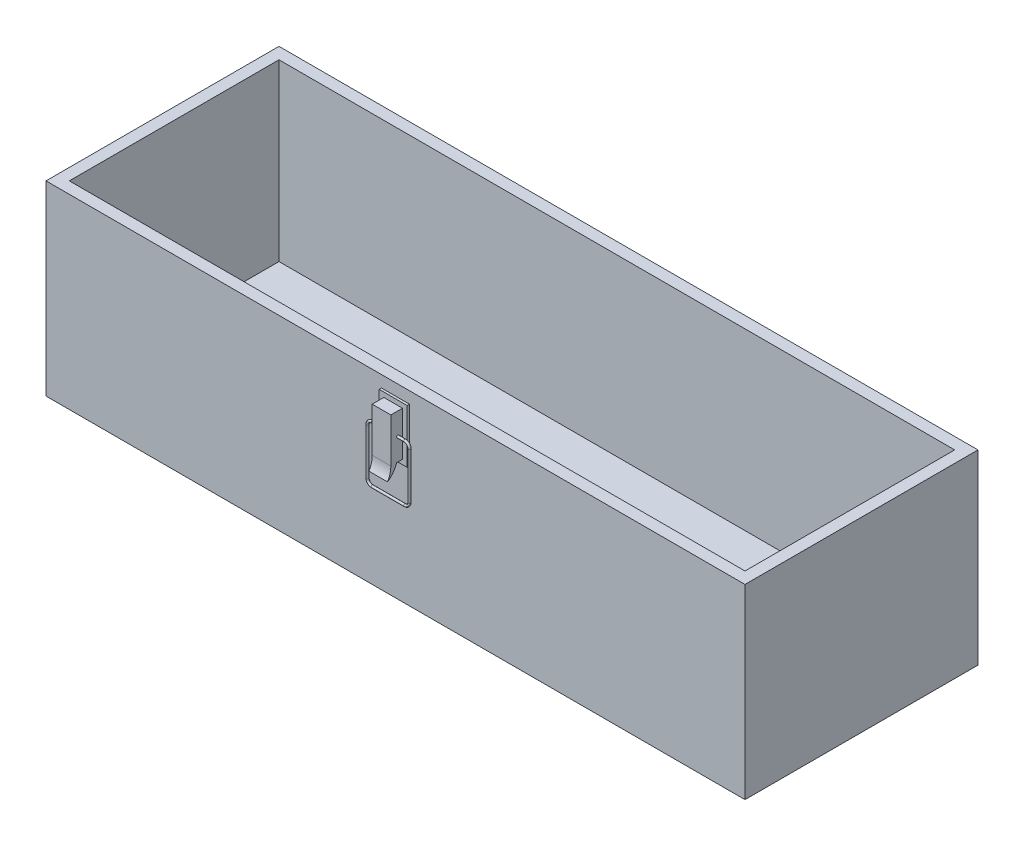
ISO-10303-21;
HEADER;
FILE_DESCRIPTION(('STEP AP214'),'2;1');
FILE_NAME('part.step','',(''),(''),'','','');
FILE_SCHEMA(('AUTOMOTIVE_DESIGN { 1 0 10303 214 1 1 1 1 }'));
ENDSEC;
DATA;
#1=APPLICATION_CONTEXT('core data for automotive mechanical design processes');
#2=APPLICATION_PROTOCOL_DEFINITION('international standard','automotive_design',2000,#1);
#3=PRODUCT_CONTEXT('',#1,'mechanical');
#4=PRODUCT('Part','Part','',(#3));
#5=PRODUCT_RELATED_PRODUCT_CATEGORY('part','',(#4));
#6=PRODUCT_DEFINITION_FORMATION('','',#4);
#7=PRODUCT_DEFINITION_CONTEXT('part definition',#1,'design');
#8=PRODUCT_DEFINITION('design','',#6,#7);
#9=PRODUCT_DEFINITION_SHAPE('','',#8);
#10=(LENGTH_UNIT() NAMED_UNIT(*) SI_UNIT(.MILLI.,.METRE.));
#11=(NAMED_UNIT(*) PLANE_ANGLE_UNIT() SI_UNIT($,.RADIAN.));
#12=(NAMED_UNIT(*) SI_UNIT($,.STERADIAN.) SOLID_ANGLE_UNIT());
#13=UNCERTAINTY_MEASURE_WITH_UNIT(LENGTH_MEASURE(1.E-05),#10,'distance_accuracy_value','');
#14=(GEOMETRIC_REPRESENTATION_CONTEXT(3) GLOBAL_UNCERTAINTY_ASSIGNED_CONTEXT((#13)) GLOBAL_UNIT_ASSIGNED_CONTEXT((#10,
#11,#12)) REPRESENTATION_CONTEXT('',''));
#15=CARTESIAN_POINT('',(0.,0.,0.));
#16=DIRECTION('',(0.,0.,1.));
#17=DIRECTION('',(1.,0.,0.));
#18=AXIS2_PLACEMENT_3D('',#15,#16,#17);
#19=CARTESIAN_POINT('',(0.,0.,51.));
#20=DIRECTION('',(0.,0.,1.));
#21=DIRECTION('',(1.,0.,0.));
#22=AXIS2_PLACEMENT_3D('',#19,#20,#21);
#23=PLANE('',#22);
#24=DIRECTION('',(0.,1.,0.));
#25=VECTOR('',#24,1.);
#26=CARTESIAN_POINT('',(5.99999999999999,75.,51.));
#27=LINE('',#26,#25);
#28=CARTESIAN_POINT('',(6.,52.,51.));
#29=VERTEX_POINT('',#28);
#30=CARTESIAN_POINT('',(5.99999999999999,75.,51.));
#31=VERTEX_POINT('',#30);
#32=EDGE_CURVE('E218',#29,#31,#27,.T.);
#33=ORIENTED_EDGE('',*,*,#32,.T.);
#34=DIRECTION('',(-1.,0.,0.));
#35=VECTOR('',#34,1.);
#36=CARTESIAN_POINT('',(-6.,75.,51.));
#37=LINE('',#36,#35);
#38=CARTESIAN_POINT('',(-6.,75.,51.));
#39=VERTEX_POINT('',#38);
#40=EDGE_CURVE('E221',#31,#39,#37,.T.);
#41=ORIENTED_EDGE('',*,*,#40,.T.);
#42=DIRECTION('',(0.,-1.,0.));
#43=VECTOR('',#42,1.);
#44=CARTESIAN_POINT('',(-6.,75.,51.));
#45=LINE('',#44,#43);
#46=CARTESIAN_POINT('',(-6.,52.,51.));
#47=VERTEX_POINT('',#46);
#48=EDGE_CURVE('E224',#39,#47,#45,.T.);
#49=ORIENTED_EDGE('',*,*,#48,.T.);
#50=DIRECTION('',(1.,0.,0.));
#51=VECTOR('',#50,1.);
#52=CARTESIAN_POINT('',(-6.,52.,51.));
#53=LINE('',#52,#51);
#54=EDGE_CURVE('E226',#47,#29,#53,.T.);
#55=ORIENTED_EDGE('',*,*,#54,.T.);
#56=EDGE_LOOP('',(#33,#41,#49,#55));
#57=FACE_BOUND('',#56,.T.);
#58=DIRECTION('',(0.,1.,0.));
#59=VECTOR('',#58,1.);
#60=CARTESIAN_POINT('',(4.,54.,51.));
#61=LINE('',#60,#59);
#62=CARTESIAN_POINT('',(4.,54.,51.));
#63=VERTEX_POINT('',#62);
#64=CARTESIAN_POINT('',(4.,73.,51.));
#65=VERTEX_POINT('',#64);
#66=EDGE_CURVE('E205',#63,#65,#61,.T.);
#67=ORIENTED_EDGE('',*,*,#66,.F.);
#68=DIRECTION('',(1.,0.,0.));
#69=VECTOR('',#68,1.);
#70=CARTESIAN_POINT('',(-4.,54.,51.));
#71=LINE('',#70,#69);
#72=CARTESIAN_POINT('',(-4.,54.,51.));
#73=VERTEX_POINT('',#72);
#74=EDGE_CURVE('E192',#73,#63,#71,.T.);
#75=ORIENTED_EDGE('',*,*,#74,.F.);
#76=DIRECTION('',(0.,-1.,0.));
#77=VECTOR('',#76,1.);
#78=CARTESIAN_POINT('',(-4.,73.,51.));
#79=LINE('',#78,#77);
#80=CARTESIAN_POINT('',(-4.,73.,51.));
#81=VERTEX_POINT('',#80);
#82=EDGE_CURVE('E195',#81,#73,#79,.T.);
#83=ORIENTED_EDGE('',*,*,#82,.F.);
#84=DIRECTION('',(-1.,0.,0.));
#85=VECTOR('',#84,1.);
#86=CARTESIAN_POINT('',(4.,73.,51.));
#87=LINE('',#86,#85);
#88=EDGE_CURVE('E207',#65,#81,#87,.T.);
#89=ORIENTED_EDGE('',*,*,#88,.F.);
#90=EDGE_LOOP('',(#67,#75,#83,#89));
#91=FACE_BOUND('',#90,.T.);
#92=ADVANCED_FACE('F33',(#57,#91),#23,.T.);
#93=CARTESIAN_POINT('',(-150.,80.,50.));
#94=DIRECTION('',(0.,0.,-1.));
#95=DIRECTION('',(-1.,0.,0.));
#96=AXIS2_PLACEMENT_3D('',#93,#94,#95);
#97=PLANE('',#96);
#98=DIRECTION('',(1.,0.,0.));
#99=VECTOR('',#98,1.);
#100=CARTESIAN_POINT('',(-150.,0.,50.));
#101=LINE('',#100,#99);
#102=CARTESIAN_POINT('',(-150.,0.,50.));
#103=VERTEX_POINT('',#102);
#104=CARTESIAN_POINT('',(150.,0.,50.));
#105=VERTEX_POINT('',#104);
#106=EDGE_CURVE('E282',#103,#105,#101,.T.);
#107=ORIENTED_EDGE('',*,*,#106,.T.);
#108=DIRECTION('',(0.,-1.,0.));
#109=VECTOR('',#108,1.);
#110=CARTESIAN_POINT('',(150.,80.,50.));
#111=LINE('',#110,#109);
#112=CARTESIAN_POINT('',(150.,80.,50.));
#113=VERTEX_POINT('',#112);
#114=EDGE_CURVE('E288',#113,#105,#111,.T.);
#115=ORIENTED_EDGE('',*,*,#114,.F.);
#116=DIRECTION('',(1.,0.,0.));
#117=VECTOR('',#116,1.);
#118=CARTESIAN_POINT('',(-150.,80.,50.));
#119=LINE('',#118,#117);
#120=CARTESIAN_POINT('',(-150.,80.,50.));
#121=VERTEX_POINT('',#120);
#122=EDGE_CURVE('E286',#121,#113,#119,.T.);
#123=ORIENTED_EDGE('',*,*,#122,.F.);
#124=DIRECTION('',(0.,-1.,0.));
#125=VECTOR('',#124,1.);
#126=CARTESIAN_POINT('',(-150.,80.,50.));
#127=LINE('',#126,#125);
#128=EDGE_CURVE('E298',#121,#103,#127,.T.);
#129=ORIENTED_EDGE('',*,*,#128,.T.);
#130=EDGE_LOOP('',(#107,#115,#123,#129));
#131=FACE_BOUND('',#130,.T.);
#132=DIRECTION('',(0.,1.,0.));
#133=VECTOR('',#132,1.);
#134=CARTESIAN_POINT('',(5.99999999999999,75.,50.));
#135=LINE('',#134,#133);
#136=CARTESIAN_POINT('',(6.,52.,50.));
#137=VERTEX_POINT('',#136);
#138=CARTESIAN_POINT('',(6.00000000000001,75.,50.));
#139=VERTEX_POINT('',#138);
#140=EDGE_CURVE('E217',#137,#139,#135,.T.);
#141=ORIENTED_EDGE('',*,*,#140,.F.);
#142=DIRECTION('',(1.,0.,0.));
#143=VECTOR('',#142,1.);
#144=CARTESIAN_POINT('',(-6.,52.,50.));
#145=LINE('',#144,#143);
#146=CARTESIAN_POINT('',(-6.00000000000001,52.,50.));
#147=VERTEX_POINT('',#146);
#148=EDGE_CURVE('E222',#147,#137,#145,.T.);
#149=ORIENTED_EDGE('',*,*,#148,.F.);
#150=DIRECTION('',(0.,-1.,0.));
#151=VECTOR('',#150,1.);
#152=CARTESIAN_POINT('',(-6.,75.,50.));
#153=LINE('',#152,#151);
#154=CARTESIAN_POINT('',(-6.,75.,50.));
#155=VERTEX_POINT('',#154);
#156=EDGE_CURVE('E232',#155,#147,#153,.T.);
#157=ORIENTED_EDGE('',*,*,#156,.F.);
#158=DIRECTION('',(-1.,0.,0.));
#159=VECTOR('',#158,1.);
#160=CARTESIAN_POINT('',(-6.,75.,50.));
#161=LINE('',#160,#159);
#162=EDGE_CURVE('E56',#139,#155,#161,.T.);
#163=ORIENTED_EDGE('',*,*,#162,.F.);
#164=EDGE_LOOP('',(#141,#149,#157,#163));
#165=FACE_BOUND('',#164,.T.);
#166=ADVANCED_FACE('F314',(#131,#165),#97,.F.);
#167=CARTESIAN_POINT('',(0.,80.,0.));
#168=DIRECTION('',(0.,-1.,0.));
#169=DIRECTION('',(0.,0.,-1.));
#170=AXIS2_PLACEMENT_3D('',#167,#168,#169);
#171=PLANE('',#170);
#172=DIRECTION('',(0.,0.,-1.));
#173=VECTOR('',#172,1.);
#174=CARTESIAN_POINT('',(150.,80.,50.));
#175=LINE('',#174,#173);
#176=CARTESIAN_POINT('',(150.,80.,-50.));
#177=VERTEX_POINT('',#176);
#178=EDGE_CURVE('E278',#113,#177,#175,.T.);
#179=ORIENTED_EDGE('',*,*,#178,.T.);
#180=DIRECTION('',(-1.,0.,0.));
#181=VECTOR('',#180,1.);
#182=CARTESIAN_POINT('',(-150.,80.,-50.));
#183=LINE('',#182,#181);
#184=CARTESIAN_POINT('',(-150.,80.,-50.));
#185=VERTEX_POINT('',#184);
#186=EDGE_CURVE('E281',#177,#185,#183,.T.);
#187=ORIENTED_EDGE('',*,*,#186,.T.);
#188=DIRECTION('',(0.,0.,1.));
#189=VECTOR('',#188,1.);
#190=CARTESIAN_POINT('',(-150.,80.,50.));
#191=LINE('',#190,#189);
#192=EDGE_CURVE('E284',#185,#121,#191,.T.);
#193=ORIENTED_EDGE('',*,*,#192,.T.);
#194=ORIENTED_EDGE('',*,*,#122,.T.);
#195=EDGE_LOOP('',(#179,#187,#193,#194));
#196=FACE_BOUND('',#195,.T.);
#197=DIRECTION('',(0.,0.,-1.));
#198=VECTOR('',#197,1.);
#199=CARTESIAN_POINT('',(145.,80.,0.));
#200=LINE('',#199,#198);
#201=CARTESIAN_POINT('',(145.,80.,45.));
#202=VERTEX_POINT('',#201);
#203=CARTESIAN_POINT('',(145.,80.,-45.));
#204=VERTEX_POINT('',#203);
#205=EDGE_CURVE('E270',#202,#204,#200,.T.);
#206=ORIENTED_EDGE('',*,*,#205,.F.);
#207=DIRECTION('',(1.,0.,0.));
#208=VECTOR('',#207,1.);
#209=CARTESIAN_POINT('',(0.,80.,45.));
#210=LINE('',#209,#208);
#211=CARTESIAN_POINT('',(-145.,80.,45.));
#212=VERTEX_POINT('',#211);
#213=EDGE_CURVE('E260',#212,#202,#210,.T.);
#214=ORIENTED_EDGE('',*,*,#213,.F.);
#215=DIRECTION('',(0.,0.,1.));
#216=VECTOR('',#215,1.);
#217=CARTESIAN_POINT('',(-145.,80.,0.));
#218=LINE('',#217,#216);
#219=CARTESIAN_POINT('',(-145.,80.,-45.));
#220=VERTEX_POINT('',#219);
#221=EDGE_CURVE('E274',#220,#212,#218,.T.);
#222=ORIENTED_EDGE('',*,*,#221,.F.);
#223=DIRECTION('',(-1.,0.,0.));
#224=VECTOR('',#223,1.);
#225=CARTESIAN_POINT('',(0.,80.,-45.));
#226=LINE('',#225,#224);
#227=EDGE_CURVE('E272',#204,#220,#226,.T.);
#228=ORIENTED_EDGE('',*,*,#227,.F.);
#229=EDGE_LOOP('',(#206,#214,#222,#228));
#230=FACE_BOUND('',#229,.T.);
#231=ADVANCED_FACE('F320',(#196,#230),#171,.F.);
#232=CARTESIAN_POINT('',(150.,80.,50.));
#233=DIRECTION('',(-1.,0.,0.));
#234=DIRECTION('',(0.,0.,1.));
#235=AXIS2_PLACEMENT_3D('',#232,#233,#234);
#236=PLANE('',#235);
#237=DIRECTION('',(0.,0.,-1.));
#238=VECTOR('',#237,1.);
#239=CARTESIAN_POINT('',(150.,0.,50.));
#240=LINE('',#239,#238);
#241=CARTESIAN_POINT('',(150.,0.,-50.));
#242=VERTEX_POINT('',#241);
#243=EDGE_CURVE('E254',#105,#242,#240,.T.);
#244=ORIENTED_EDGE('',*,*,#243,.T.);
#245=DIRECTION('',(0.,-1.,0.));
#246=VECTOR('',#245,1.);
#247=CARTESIAN_POINT('',(150.,80.,-50.));
#248=LINE('',#247,#246);
#249=EDGE_CURVE('E11',#177,#242,#248,.T.);
#250=ORIENTED_EDGE('',*,*,#249,.F.);
#251=ORIENTED_EDGE('',*,*,#178,.F.);
#252=ORIENTED_EDGE('',*,*,#114,.T.);
#253=EDGE_LOOP('',(#244,#250,#251,#252));
#254=FACE_BOUND('',#253,.T.);
#255=ADVANCED_FACE('F35',(#254),#236,.F.);
#256=CARTESIAN_POINT('',(-150.,80.,-50.));
#257=DIRECTION('',(0.,0.,1.));
#258=DIRECTION('',(1.,0.,0.));
#259=AXIS2_PLACEMENT_3D('',#256,#257,#258);
#260=PLANE('',#259);
#261=DIRECTION('',(-1.,0.,0.));
#262=VECTOR('',#261,1.);
#263=CARTESIAN_POINT('',(-150.,0.,-50.));
#264=LINE('',#263,#262);
#265=CARTESIAN_POINT('',(-150.,0.,-50.));
#266=VERTEX_POINT('',#265);
#267=EDGE_CURVE('E291',#242,#266,#264,.T.);
#268=ORIENTED_EDGE('',*,*,#267,.T.);
#269=DIRECTION('',(0.,-1.,0.));
#270=VECTOR('',#269,1.);
#271=CARTESIAN_POINT('',(-150.,80.,-50.));
#272=LINE('',#271,#270);
#273=EDGE_CURVE('E41',#185,#266,#272,.T.);
#274=ORIENTED_EDGE('',*,*,#273,.F.);
#275=ORIENTED_EDGE('',*,*,#186,.F.);
#276=ORIENTED_EDGE('',*,*,#249,.T.);
#277=EDGE_LOOP('',(#268,#274,#275,#276));
#278=FACE_BOUND('',#277,.T.);
#279=ADVANCED_FACE('F322',(#278),#260,.F.);
#280=CARTESIAN_POINT('',(-150.,80.,50.));
#281=DIRECTION('',(1.,0.,0.));
#282=DIRECTION('',(0.,0.,-1.));
#283=AXIS2_PLACEMENT_3D('',#280,#281,#282);
#284=PLANE('',#283);
#285=DIRECTION('',(0.,0.,1.));
#286=VECTOR('',#285,1.);
#287=CARTESIAN_POINT('',(-150.,0.,50.));
#288=LINE('',#287,#286);
#289=EDGE_CURVE('E293',#266,#103,#288,.T.);
#290=ORIENTED_EDGE('',*,*,#289,.T.);
#291=ORIENTED_EDGE('',*,*,#128,.F.);
#292=ORIENTED_EDGE('',*,*,#192,.F.);
#293=ORIENTED_EDGE('',*,*,#273,.T.);
#294=EDGE_LOOP('',(#290,#291,#292,#293));
#295=FACE_BOUND('',#294,.T.);
#296=ADVANCED_FACE('F305',(#295),#284,.F.);
#297=CARTESIAN_POINT('',(0.,0.,0.));
#298=DIRECTION('',(0.,-1.,0.));
#299=DIRECTION('',(0.,0.,-1.));
#300=AXIS2_PLACEMENT_3D('',#297,#298,#299);
#301=PLANE('',#300);
#302=ORIENTED_EDGE('',*,*,#243,.F.);
#303=ORIENTED_EDGE('',*,*,#106,.F.);
#304=ORIENTED_EDGE('',*,*,#289,.F.);
#305=ORIENTED_EDGE('',*,*,#267,.F.);
#306=EDGE_LOOP('',(#302,#303,#304,#305));
#307=FACE_BOUND('',#306,.T.);
#308=ADVANCED_FACE('F311',(#307),#301,.T.);
#309=CARTESIAN_POINT('',(145.,80.,50.));
#310=DIRECTION('',(-1.,0.,0.));
#311=DIRECTION('',(0.,0.,1.));
#312=AXIS2_PLACEMENT_3D('',#309,#310,#311);
#313=PLANE('',#312);
#314=DIRECTION('',(0.,0.,-1.));
#315=VECTOR('',#314,1.);
#316=CARTESIAN_POINT('',(145.,5.,0.));
#317=LINE('',#316,#315);
#318=CARTESIAN_POINT('',(145.,5.,45.));
#319=VERTEX_POINT('',#318);
#320=CARTESIAN_POINT('',(145.,5.,-45.));
#321=VERTEX_POINT('',#320);
#322=EDGE_CURVE('E247',#319,#321,#317,.T.);
#323=ORIENTED_EDGE('',*,*,#322,.F.);
#324=DIRECTION('',(0.,-1.,0.));
#325=VECTOR('',#324,1.);
#326=CARTESIAN_POINT('',(145.,80.,45.));
#327=LINE('',#326,#325);
#328=EDGE_CURVE('E256',#202,#319,#327,.T.);
#329=ORIENTED_EDGE('',*,*,#328,.F.);
#330=ORIENTED_EDGE('',*,*,#205,.T.);
#331=DIRECTION('',(0.,-1.,0.));
#332=VECTOR('',#331,1.);
#333=CARTESIAN_POINT('',(145.,80.,-45.));
#334=LINE('',#333,#332);
#335=EDGE_CURVE('E251',#204,#321,#334,.T.);
#336=ORIENTED_EDGE('',*,*,#335,.T.);
#337=EDGE_LOOP('',(#323,#329,#330,#336));
#338=FACE_BOUND('',#337,.T.);
#339=ADVANCED_FACE('F358',(#338),#313,.T.);
#340=CARTESIAN_POINT('',(-150.,80.,-45.));
#341=DIRECTION('',(0.,0.,1.));
#342=DIRECTION('',(1.,0.,0.));
#343=AXIS2_PLACEMENT_3D('',#340,#341,#342);
#344=PLANE('',#343);
#345=DIRECTION('',(-1.,0.,0.));
#346=VECTOR('',#345,1.);
#347=CARTESIAN_POINT('',(0.,5.,-45.));
#348=LINE('',#347,#346);
#349=CARTESIAN_POINT('',(-145.,5.,-45.));
#350=VERTEX_POINT('',#349);
#351=EDGE_CURVE('E250',#321,#350,#348,.T.);
#352=ORIENTED_EDGE('',*,*,#351,.F.);
#353=ORIENTED_EDGE('',*,*,#335,.F.);
#354=ORIENTED_EDGE('',*,*,#227,.T.);
#355=DIRECTION('',(0.,-1.,0.));
#356=VECTOR('',#355,1.);
#357=CARTESIAN_POINT('',(-145.,80.,-45.));
#358=LINE('',#357,#356);
#359=EDGE_CURVE('E255',#220,#350,#358,.T.);
#360=ORIENTED_EDGE('',*,*,#359,.T.);
#361=EDGE_LOOP('',(#352,#353,#354,#360));
#362=FACE_BOUND('',#361,.T.);
#363=ADVANCED_FACE('F361',(#362),#344,.T.);
#364=CARTESIAN_POINT('',(-145.,80.,50.));
#365=DIRECTION('',(1.,0.,0.));
#366=DIRECTION('',(0.,0.,-1.));
#367=AXIS2_PLACEMENT_3D('',#364,#365,#366);
#368=PLANE('',#367);
#369=DIRECTION('',(0.,0.,1.));
#370=VECTOR('',#369,1.);
#371=CARTESIAN_POINT('',(-145.,5.,0.));
#372=LINE('',#371,#370);
#373=CARTESIAN_POINT('',(-145.,5.,45.));
#374=VERTEX_POINT('',#373);
#375=EDGE_CURVE('E262',#350,#374,#372,.T.);
#376=ORIENTED_EDGE('',*,*,#375,.F.);
#377=ORIENTED_EDGE('',*,*,#359,.F.);
#378=ORIENTED_EDGE('',*,*,#221,.T.);
#379=DIRECTION('',(0.,-1.,0.));
#380=VECTOR('',#379,1.);
#381=CARTESIAN_POINT('',(-145.,80.,45.));
#382=LINE('',#381,#380);
#383=EDGE_CURVE('E259',#212,#374,#382,.T.);
#384=ORIENTED_EDGE('',*,*,#383,.T.);
#385=EDGE_LOOP('',(#376,#377,#378,#384));
#386=FACE_BOUND('',#385,.T.);
#387=ADVANCED_FACE('F365',(#386),#368,.T.);
#388=CARTESIAN_POINT('',(-150.,80.,45.));
#389=DIRECTION('',(0.,0.,-1.));
#390=DIRECTION('',(-1.,0.,0.));
#391=AXIS2_PLACEMENT_3D('',#388,#389,#390);
#392=PLANE('',#391);
#393=DIRECTION('',(1.,0.,0.));
#394=VECTOR('',#393,1.);
#395=CARTESIAN_POINT('',(0.,5.,45.));
#396=LINE('',#395,#394);
#397=EDGE_CURVE('E266',#374,#319,#396,.T.);
#398=ORIENTED_EDGE('',*,*,#397,.F.);
#399=ORIENTED_EDGE('',*,*,#383,.F.);
#400=ORIENTED_EDGE('',*,*,#213,.T.);
#401=ORIENTED_EDGE('',*,*,#328,.T.);
#402=EDGE_LOOP('',(#398,#399,#400,#401));
#403=FACE_BOUND('',#402,.T.);
#404=ADVANCED_FACE('F369',(#403),#392,.T.);
#405=CARTESIAN_POINT('',(0.,5.,0.));
#406=DIRECTION('',(0.,-1.,0.));
#407=DIRECTION('',(0.,0.,-1.));
#408=AXIS2_PLACEMENT_3D('',#405,#406,#407);
#409=PLANE('',#408);
#410=ORIENTED_EDGE('',*,*,#322,.T.);
#411=ORIENTED_EDGE('',*,*,#351,.T.);
#412=ORIENTED_EDGE('',*,*,#375,.T.);
#413=ORIENTED_EDGE('',*,*,#397,.T.);
#414=EDGE_LOOP('',(#410,#411,#412,#413));
#415=FACE_BOUND('',#414,.T.);
#416=ADVANCED_FACE('F356',(#415),#409,.F.);
#417=CARTESIAN_POINT('',(5.99999999999999,75.,51.));
#418=DIRECTION('',(-1.,0.,0.));
#419=DIRECTION('',(0.,-1.,0.));
#420=AXIS2_PLACEMENT_3D('',#417,#418,#419);
#421=PLANE('',#420);
#422=ORIENTED_EDGE('',*,*,#140,.T.);
#423=DIRECTION('',(0.,0.,-1.));
#424=VECTOR('',#423,1.);
#425=CARTESIAN_POINT('',(5.99999999999999,75.,51.));
#426=LINE('',#425,#424);
#427=EDGE_CURVE('E245',#31,#139,#426,.T.);
#428=ORIENTED_EDGE('',*,*,#427,.F.);
#429=ORIENTED_EDGE('',*,*,#32,.F.);
#430=DIRECTION('',(0.,0.,-1.));
#431=VECTOR('',#430,1.);
#432=CARTESIAN_POINT('',(6.,52.,51.));
#433=LINE('',#432,#431);
#434=EDGE_CURVE('E228',#29,#137,#433,.T.);
#435=ORIENTED_EDGE('',*,*,#434,.T.);
#436=EDGE_LOOP('',(#422,#428,#429,#435));
#437=FACE_BOUND('',#436,.T.);
#438=ADVANCED_FACE('F352',(#437),#421,.F.);
#439=CARTESIAN_POINT('',(-6.,75.,51.));
#440=DIRECTION('',(0.,-1.,0.));
#441=DIRECTION('',(0.,0.,-1.));
#442=AXIS2_PLACEMENT_3D('',#439,#440,#441);
#443=PLANE('',#442);
#444=ORIENTED_EDGE('',*,*,#162,.T.);
#445=DIRECTION('',(0.,0.,-1.));
#446=VECTOR('',#445,1.);
#447=CARTESIAN_POINT('',(-6.,75.,51.));
#448=LINE('',#447,#446);
#449=EDGE_CURVE('E242',#39,#155,#448,.T.);
#450=ORIENTED_EDGE('',*,*,#449,.F.);
#451=ORIENTED_EDGE('',*,*,#40,.F.);
#452=ORIENTED_EDGE('',*,*,#427,.T.);
#453=EDGE_LOOP('',(#444,#450,#451,#452));
#454=FACE_BOUND('',#453,.T.);
#455=ADVANCED_FACE('F348',(#454),#443,.F.);
#456=CARTESIAN_POINT('',(-6.,75.,51.));
#457=DIRECTION('',(1.,0.,0.));
#458=DIRECTION('',(0.,1.,0.));
#459=AXIS2_PLACEMENT_3D('',#456,#457,#458);
#460=PLANE('',#459);
#461=ORIENTED_EDGE('',*,*,#156,.T.);
#462=DIRECTION('',(0.,0.,-1.));
#463=VECTOR('',#462,1.);
#464=CARTESIAN_POINT('',(-6.,52.,51.));
#465=LINE('',#464,#463);
#466=EDGE_CURVE('E239',#47,#147,#465,.T.);
#467=ORIENTED_EDGE('',*,*,#466,.F.);
#468=ORIENTED_EDGE('',*,*,#48,.F.);
#469=ORIENTED_EDGE('',*,*,#449,.T.);
#470=EDGE_LOOP('',(#461,#467,#468,#469));
#471=FACE_BOUND('',#470,.T.);
#472=ADVANCED_FACE('F344',(#471),#460,.F.);
#473=CARTESIAN_POINT('',(-6.,52.,51.));
#474=DIRECTION('',(0.,1.,0.));
#475=DIRECTION('',(0.,0.,1.));
#476=AXIS2_PLACEMENT_3D('',#473,#474,#475);
#477=PLANE('',#476);
#478=ORIENTED_EDGE('',*,*,#148,.T.);
#479=ORIENTED_EDGE('',*,*,#434,.F.);
#480=ORIENTED_EDGE('',*,*,#54,.F.);
#481=ORIENTED_EDGE('',*,*,#466,.T.);
#482=EDGE_LOOP('',(#478,#479,#480,#481));
#483=FACE_BOUND('',#482,.T.);
#484=ADVANCED_FACE('F341',(#483),#477,.F.);
#485=CARTESIAN_POINT('',(-4.,54.,56.));
#486=DIRECTION('',(0.,1.,0.));
#487=DIRECTION('',(0.,0.,1.));
#488=AXIS2_PLACEMENT_3D('',#485,#486,#487);
#489=PLANE('',#488);
#490=DIRECTION('',(0.,0.,-1.));
#491=VECTOR('',#490,1.);
#492=CARTESIAN_POINT('',(4.,54.,56.));
#493=LINE('',#492,#491);
#494=CARTESIAN_POINT('',(4.,54.,53.5));
#495=VERTEX_POINT('',#494);
#496=EDGE_CURVE('E215',#495,#63,#493,.T.);
#497=ORIENTED_EDGE('',*,*,#496,.F.);
#498=DIRECTION('',(1.,0.,0.));
#499=VECTOR('',#498,1.);
#500=CARTESIAN_POINT('',(-10.5044333724915,54.,53.5));
#501=LINE('',#500,#499);
#502=CARTESIAN_POINT('',(-4.,54.,53.5));
#503=VERTEX_POINT('',#502);
#504=EDGE_CURVE('E169',#503,#495,#501,.T.);
#505=ORIENTED_EDGE('',*,*,#504,.F.);
#506=DIRECTION('',(0.,0.,-1.));
#507=VECTOR('',#506,1.);
#508=CARTESIAN_POINT('',(-4.,54.,56.));
#509=LINE('',#508,#507);
#510=EDGE_CURVE('E202',#503,#73,#509,.T.);
#511=ORIENTED_EDGE('',*,*,#510,.T.);
#512=ORIENTED_EDGE('',*,*,#74,.T.);
#513=EDGE_LOOP('',(#497,#505,#511,#512));
#514=FACE_BOUND('',#513,.T.);
#515=ADVANCED_FACE('F339',(#514),#489,.F.);
#516=CARTESIAN_POINT('',(4.,54.,56.));
#517=DIRECTION('',(-1.,0.,0.));
#518=DIRECTION('',(0.,-1.,0.));
#519=AXIS2_PLACEMENT_3D('',#516,#517,#518);
#520=PLANE('',#519);
#521=CARTESIAN_POINT('',(4.,63.5,53.));
#522=DIRECTION('',(-1.,0.,0.));
#523=DIRECTION('',(0.,-1.,0.));
#524=AXIS2_PLACEMENT_3D('',#521,#522,#523);
#525=CIRCLE('',#524,0.499999999999999);
#526=CARTESIAN_POINT('',(4.,63.,53.));
#527=VERTEX_POINT('',#526);
#528=EDGE_CURVE('E182',#527,#527,#525,.T.);
#529=ORIENTED_EDGE('',*,*,#528,.T.);
#530=EDGE_LOOP('',(#529));
#531=FACE_BOUND('',#530,.T.);
#532=ORIENTED_EDGE('',*,*,#66,.T.);
#533=DIRECTION('',(0.,0.,-1.));
#534=VECTOR('',#533,1.);
#535=CARTESIAN_POINT('',(4.,73.,56.));
#536=LINE('',#535,#534);
#537=CARTESIAN_POINT('',(4.,73.,56.));
#538=VERTEX_POINT('',#537);
#539=EDGE_CURVE('E212',#538,#65,#536,.T.);
#540=ORIENTED_EDGE('',*,*,#539,.F.);
#541=DIRECTION('',(0.,1.,0.));
#542=VECTOR('',#541,1.);
#543=CARTESIAN_POINT('',(4.,54.,56.));
#544=LINE('',#543,#542);
#545=CARTESIAN_POINT('',(4.,54.,56.));
#546=VERTEX_POINT('',#545);
#547=EDGE_CURVE('E180',#546,#538,#544,.T.);
#548=ORIENTED_EDGE('',*,*,#547,.F.);
#549=CARTESIAN_POINT('',(4.,54.,66.4233330154484));
#550=DIRECTION('',(-1.,0.,0.));
#551=DIRECTION('',(0.,-1.,0.));
#552=AXIS2_PLACEMENT_3D('',#549,#550,#551);
#553=CIRCLE('',#552,10.4233330154484);
#554=CARTESIAN_POINT('',(4.,48.7907620506127,57.3950601386685));
#555=VERTEX_POINT('',#554);
#556=EDGE_CURVE('E165',#546,#555,#553,.T.);
#557=ORIENTED_EDGE('',*,*,#556,.T.);
#558=CARTESIAN_POINT('',(4.,57.3255965577461,63.3785767540696));
#559=DIRECTION('',(1.,0.,0.));
#560=DIRECTION('',(0.,-1.,0.));
#561=AXIS2_PLACEMENT_3D('',#558,#559,#560);
#562=CIRCLE('',#561,10.4233330154484);
#563=EDGE_CURVE('E170',#555,#495,#562,.T.);
#564=ORIENTED_EDGE('',*,*,#563,.T.);
#565=ORIENTED_EDGE('',*,*,#496,.T.);
#566=EDGE_LOOP('',(#532,#540,#548,#557,#564,#565));
#567=FACE_BOUND('',#566,.T.);
#568=ADVANCED_FACE('F178',(#531,#567),#520,.F.);
#569=CARTESIAN_POINT('',(4.,73.,56.));
#570=DIRECTION('',(0.,-1.,0.));
#571=DIRECTION('',(0.,0.,-1.));
#572=AXIS2_PLACEMENT_3D('',#569,#570,#571);
#573=PLANE('',#572);
#574=ORIENTED_EDGE('',*,*,#88,.T.);
#575=DIRECTION('',(0.,0.,-1.));
#576=VECTOR('',#575,1.);
#577=CARTESIAN_POINT('',(-4.,73.,56.));
#578=LINE('',#577,#576);
#579=CARTESIAN_POINT('',(-4.,73.,56.));
#580=VERTEX_POINT('',#579);
#581=EDGE_CURVE('E48',#580,#81,#578,.T.);
#582=ORIENTED_EDGE('',*,*,#581,.F.);
#583=DIRECTION('',(-1.,0.,0.));
#584=VECTOR('',#583,1.);
#585=CARTESIAN_POINT('',(4.,73.,56.));
#586=LINE('',#585,#584);
#587=EDGE_CURVE('E197',#538,#580,#586,.T.);
#588=ORIENTED_EDGE('',*,*,#587,.F.);
#589=ORIENTED_EDGE('',*,*,#539,.T.);
#590=EDGE_LOOP('',(#574,#582,#588,#589));
#591=FACE_BOUND('',#590,.T.);
#592=ADVANCED_FACE('F436',(#591),#573,.F.);
#593=CARTESIAN_POINT('',(-4.,73.,56.));
#594=DIRECTION('',(1.,0.,0.));
#595=DIRECTION('',(0.,1.,0.));
#596=AXIS2_PLACEMENT_3D('',#593,#594,#595);
#597=PLANE('',#596);
#598=CARTESIAN_POINT('',(-4.,63.5,53.));
#599=DIRECTION('',(-1.,0.,0.));
#600=DIRECTION('',(0.,-1.,0.));
#601=AXIS2_PLACEMENT_3D('',#598,#599,#600);
#602=CIRCLE('',#601,0.499999999999999);
#603=CARTESIAN_POINT('',(-4.,63.,53.));
#604=VERTEX_POINT('',#603);
#605=EDGE_CURVE('E657',#604,#604,#602,.T.);
#606=ORIENTED_EDGE('',*,*,#605,.F.);
#607=EDGE_LOOP('',(#606));
#608=FACE_BOUND('',#607,.T.);
#609=ORIENTED_EDGE('',*,*,#82,.T.);
#610=ORIENTED_EDGE('',*,*,#510,.F.);
#611=CARTESIAN_POINT('',(-4.,57.3255965577461,63.3785767540696));
#612=DIRECTION('',(1.,0.,0.));
#613=DIRECTION('',(0.,1.,0.));
#614=AXIS2_PLACEMENT_3D('',#611,#612,#613);
#615=CIRCLE('',#614,10.4233330154484);
#616=CARTESIAN_POINT('',(-4.,48.7907620506127,57.3950601386685));
#617=VERTEX_POINT('',#616);
#618=EDGE_CURVE('E190',#503,#617,#615,.F.);
#619=ORIENTED_EDGE('',*,*,#618,.T.);
#620=CARTESIAN_POINT('',(-4.,54.,66.4233330154484));
#621=DIRECTION('',(1.,0.,0.));
#622=DIRECTION('',(0.,1.,0.));
#623=AXIS2_PLACEMENT_3D('',#620,#621,#622);
#624=CIRCLE('',#623,10.4233330154484);
#625=CARTESIAN_POINT('',(-4.,54.,56.));
#626=VERTEX_POINT('',#625);
#627=EDGE_CURVE('E167',#617,#626,#624,.T.);
#628=ORIENTED_EDGE('',*,*,#627,.T.);
#629=DIRECTION('',(0.,-1.,0.));
#630=VECTOR('',#629,1.);
#631=CARTESIAN_POINT('',(-4.,73.,56.));
#632=LINE('',#631,#630);
#633=EDGE_CURVE('E199',#580,#626,#632,.T.);
#634=ORIENTED_EDGE('',*,*,#633,.F.);
#635=ORIENTED_EDGE('',*,*,#581,.T.);
#636=EDGE_LOOP('',(#609,#610,#619,#628,#634,#635));
#637=FACE_BOUND('',#636,.T.);
#638=ADVANCED_FACE('F444',(#608,#637),#597,.F.);
#639=CARTESIAN_POINT('',(0.,0.,56.));
#640=DIRECTION('',(0.,0.,1.));
#641=DIRECTION('',(1.,0.,0.));
#642=AXIS2_PLACEMENT_3D('',#639,#640,#641);
#643=PLANE('',#642);
#644=DIRECTION('',(1.,0.,0.));
#645=VECTOR('',#644,1.);
#646=CARTESIAN_POINT('',(-4.,54.,56.));
#647=LINE('',#646,#645);
#648=EDGE_CURVE('E193',#626,#546,#647,.T.);
#649=ORIENTED_EDGE('',*,*,#648,.T.);
#650=ORIENTED_EDGE('',*,*,#547,.T.);
#651=ORIENTED_EDGE('',*,*,#587,.T.);
#652=ORIENTED_EDGE('',*,*,#633,.T.);
#653=EDGE_LOOP('',(#649,#650,#651,#652));
#654=FACE_BOUND('',#653,.T.);
#655=ADVANCED_FACE('F451',(#654),#643,.T.);
#656=CARTESIAN_POINT('',(-10.5044333724915,54.,66.4233330154484));
#657=DIRECTION('',(1.,0.,0.));
#658=DIRECTION('',(0.,1.,0.));
#659=AXIS2_PLACEMENT_3D('',#656,#657,#658);
#660=CYLINDRICAL_SURFACE('',#659,10.4233330154484);
#661=ORIENTED_EDGE('',*,*,#627,.F.);
#662=DIRECTION('',(1.,0.,0.));
#663=VECTOR('',#662,1.);
#664=CARTESIAN_POINT('',(-10.5044333724915,48.7907620506127,57.3950601386685));
#665=LINE('',#664,#663);
#666=EDGE_CURVE('E160',#617,#555,#665,.T.);
#667=ORIENTED_EDGE('',*,*,#666,.T.);
#668=ORIENTED_EDGE('',*,*,#556,.F.);
#669=ORIENTED_EDGE('',*,*,#648,.F.);
#670=EDGE_LOOP('',(#661,#667,#668,#669));
#671=FACE_BOUND('',#670,.T.);
#672=ADVANCED_FACE('F162',(#671),#660,.F.);
#673=CARTESIAN_POINT('',(-10.5044333724915,57.3255965577461,63.3785767540696));
#674=DIRECTION('',(1.,0.,0.));
#675=DIRECTION('',(0.,1.,0.));
#676=AXIS2_PLACEMENT_3D('',#673,#674,#675);
#677=CYLINDRICAL_SURFACE('',#676,10.4233330154484);
#678=ORIENTED_EDGE('',*,*,#618,.F.);
#679=ORIENTED_EDGE('',*,*,#504,.T.);
#680=ORIENTED_EDGE('',*,*,#563,.F.);
#681=ORIENTED_EDGE('',*,*,#666,.F.);
#682=EDGE_LOOP('',(#678,#679,#680,#681));
#683=FACE_BOUND('',#682,.T.);
#684=ADVANCED_FACE('F173',(#683),#677,.T.);
#685=CARTESIAN_POINT('',(-4.,63.5,53.));
#686=DIRECTION('',(-1.,0.,0.));
#687=DIRECTION('',(0.,0.,1.));
#688=AXIS2_PLACEMENT_3D('',#685,#686,#687);
#689=CYLINDRICAL_SURFACE('',#688,0.499999999999999);
#690=CARTESIAN_POINT('',(-6.99999999999999,63.5,53.));
#691=DIRECTION('',(-1.,0.,0.));
#692=DIRECTION('',(0.,-1.,0.));
#693=AXIS2_PLACEMENT_3D('',#690,#691,#692);
#694=CIRCLE('',#693,0.499999999999999);
#695=CARTESIAN_POINT('',(-6.99999999999999,64.,53.));
#696=VERTEX_POINT('',#695);
#697=EDGE_CURVE('E654',#696,#696,#694,.T.);
#698=ORIENTED_EDGE('',*,*,#697,.F.);
#699=EDGE_LOOP('',(#698));
#700=FACE_BOUND('',#699,.T.);
#701=ORIENTED_EDGE('',*,*,#605,.T.);
#702=EDGE_LOOP('',(#701));
#703=FACE_BOUND('',#702,.T.);
#704=ADVANCED_FACE('F471',(#700,#703),#689,.T.);
#705=CARTESIAN_POINT('',(-7.00000000000001,61.5,53.));
#706=DIRECTION('',(0.,0.,1.));
#707=DIRECTION('',(1.,0.,0.));
#708=AXIS2_PLACEMENT_3D('',#705,#706,#707);
#709=TOROIDAL_SURFACE('',#708,1.99999999999997,0.499999999999999);
#710=CARTESIAN_POINT('',(-9.00000000000001,61.5,53.));
#711=DIRECTION('',(0.,-1.,0.));
#712=DIRECTION('',(1.,0.,0.));
#713=AXIS2_PLACEMENT_3D('',#710,#711,#712);
#714=CIRCLE('',#713,0.499999999999999);
#715=CARTESIAN_POINT('',(-9.49999999999998,61.5,53.));
#716=VERTEX_POINT('',#715);
#717=EDGE_CURVE('E651',#716,#716,#714,.T.);
#718=CARTESIAN_POINT('',(-7.00000000000001,61.5,53.));
#719=DIRECTION('',(0.,0.,1.));
#720=DIRECTION('',(1.,0.,0.));
#721=AXIS2_PLACEMENT_3D('',#718,#719,#720);
#722=CIRCLE('',#721,2.49999999999997);
#723=EDGE_CURVE('',#696,#716,#722,.T.);
#724=ORIENTED_EDGE('',*,*,#697,.T.);
#725=ORIENTED_EDGE('',*,*,#717,.F.);
#726=ORIENTED_EDGE('',*,*,#723,.T.);
#727=ORIENTED_EDGE('',*,*,#723,.F.);
#728=EDGE_LOOP('',(#724,#726,#725,#727));
#729=FACE_BOUND('',#728,.T.);
#730=ADVANCED_FACE('F478',(#729),#709,.T.);
#731=CARTESIAN_POINT('',(-9.00000000000001,61.5,53.));
#732=DIRECTION('',(0.,-1.,0.));
#733=DIRECTION('',(0.,0.,-1.));
#734=AXIS2_PLACEMENT_3D('',#731,#732,#733);
#735=CYLINDRICAL_SURFACE('',#734,0.499999999999999);
#736=CARTESIAN_POINT('',(-9.00000000000001,41.5,53.));
#737=DIRECTION('',(0.,-1.,0.));
#738=DIRECTION('',(1.,0.,0.));
#739=AXIS2_PLACEMENT_3D('',#736,#737,#738);
#740=CIRCLE('',#739,0.499999999999999);
#741=CARTESIAN_POINT('',(-9.50000000000001,41.5,53.));
#742=VERTEX_POINT('',#741);
#743=EDGE_CURVE('E648',#742,#742,#740,.T.);
#744=ORIENTED_EDGE('',*,*,#743,.F.);
#745=EDGE_LOOP('',(#744));
#746=FACE_BOUND('',#745,.T.);
#747=ORIENTED_EDGE('',*,*,#717,.T.);
#748=EDGE_LOOP('',(#747));
#749=FACE_BOUND('',#748,.T.);
#750=ADVANCED_FACE('F486',(#746,#749),#735,.T.);
#751=CARTESIAN_POINT('',(-7.00000000000001,41.5,53.));
#752=DIRECTION('',(0.,0.,1.));
#753=DIRECTION('',(1.,0.,0.));
#754=AXIS2_PLACEMENT_3D('',#751,#752,#753);
#755=TOROIDAL_SURFACE('',#754,2.,0.499999999999999);
#756=CARTESIAN_POINT('',(-6.99999999999999,39.5,53.));
#757=DIRECTION('',(1.,0.,0.));
#758=DIRECTION('',(0.,1.,0.));
#759=AXIS2_PLACEMENT_3D('',#756,#757,#758);
#760=CIRCLE('',#759,0.499999999999999);
#761=CARTESIAN_POINT('',(-6.99999999999999,39.,53.));
#762=VERTEX_POINT('',#761);
#763=EDGE_CURVE('E645',#762,#762,#760,.T.);
#764=CARTESIAN_POINT('',(-7.00000000000001,41.5,53.));
#765=DIRECTION('',(0.,0.,1.));
#766=DIRECTION('',(1.,0.,0.));
#767=AXIS2_PLACEMENT_3D('',#764,#765,#766);
#768=CIRCLE('',#767,2.5);
#769=EDGE_CURVE('',#742,#762,#768,.T.);
#770=ORIENTED_EDGE('',*,*,#743,.T.);
#771=ORIENTED_EDGE('',*,*,#763,.F.);
#772=ORIENTED_EDGE('',*,*,#769,.T.);
#773=ORIENTED_EDGE('',*,*,#769,.F.);
#774=EDGE_LOOP('',(#770,#772,#771,#773));
#775=FACE_BOUND('',#774,.T.);
#776=ADVANCED_FACE('F494',(#775),#755,.T.);
#777=CARTESIAN_POINT('',(-6.99999999999999,39.5,53.));
#778=DIRECTION('',(1.,0.,0.));
#779=DIRECTION('',(0.,0.,-1.));
#780=AXIS2_PLACEMENT_3D('',#777,#778,#779);
#781=CYLINDRICAL_SURFACE('',#780,0.499999999999999);
#782=CARTESIAN_POINT('',(6.99999999999989,39.5,53.));
#783=DIRECTION('',(1.,0.,0.));
#784=DIRECTION('',(0.,1.,0.));
#785=AXIS2_PLACEMENT_3D('',#782,#783,#784);
#786=CIRCLE('',#785,0.499999999999999);
#787=CARTESIAN_POINT('',(6.99999999999989,39.,53.));
#788=VERTEX_POINT('',#787);
#789=EDGE_CURVE('E642',#788,#788,#786,.T.);
#790=ORIENTED_EDGE('',*,*,#789,.F.);
#791=EDGE_LOOP('',(#790));
#792=FACE_BOUND('',#791,.T.);
#793=ORIENTED_EDGE('',*,*,#763,.T.);
#794=EDGE_LOOP('',(#793));
#795=FACE_BOUND('',#794,.T.);
#796=ADVANCED_FACE('F502',(#792,#795),#781,.T.);
#797=CARTESIAN_POINT('',(6.99999999999991,41.5,53.));
#798=DIRECTION('',(0.,0.,1.));
#799=DIRECTION('',(1.,0.,0.));
#800=AXIS2_PLACEMENT_3D('',#797,#798,#799);
#801=TOROIDAL_SURFACE('',#800,1.99999999999999,0.499999999999999);
#802=CARTESIAN_POINT('',(8.99999999999991,41.5,53.));
#803=DIRECTION('',(0.,1.,0.));
#804=DIRECTION('',(-1.,0.,0.));
#805=AXIS2_PLACEMENT_3D('',#802,#803,#804);
#806=CIRCLE('',#805,0.499999999999999);
#807=CARTESIAN_POINT('',(9.4999999999999,41.5,53.));
#808=VERTEX_POINT('',#807);
#809=EDGE_CURVE('E637',#808,#808,#806,.T.);
#810=CARTESIAN_POINT('',(6.99999999999991,41.5,53.));
#811=DIRECTION('',(0.,0.,1.));
#812=DIRECTION('',(1.,0.,0.));
#813=AXIS2_PLACEMENT_3D('',#810,#811,#812);
#814=CIRCLE('',#813,2.49999999999999);
#815=EDGE_CURVE('',#788,#808,#814,.T.);
#816=ORIENTED_EDGE('',*,*,#789,.T.);
#817=ORIENTED_EDGE('',*,*,#809,.F.);
#818=ORIENTED_EDGE('',*,*,#815,.T.);
#819=ORIENTED_EDGE('',*,*,#815,.F.);
#820=EDGE_LOOP('',(#816,#818,#817,#819));
#821=FACE_BOUND('',#820,.T.);
#822=ADVANCED_FACE('F510',(#821),#801,.T.);
#823=CARTESIAN_POINT('',(8.9999999999999,41.5,53.));
#824=DIRECTION('',(0.,1.,0.));
#825=DIRECTION('',(-1.,0.,0.));
#826=AXIS2_PLACEMENT_3D('',#823,#824,#825);
#827=CYLINDRICAL_SURFACE('',#826,0.499999999999999);
#828=CARTESIAN_POINT('',(9.,61.5,53.));
#829=DIRECTION('',(0.,1.,0.));
#830=DIRECTION('',(-1.,0.,0.));
#831=AXIS2_PLACEMENT_3D('',#828,#829,#830);
#832=CIRCLE('',#831,0.499999999999999);
#833=CARTESIAN_POINT('',(9.5,61.5,53.));
#834=VERTEX_POINT('',#833);
#835=EDGE_CURVE('E634',#834,#834,#832,.T.);
#836=ORIENTED_EDGE('',*,*,#835,.F.);
#837=EDGE_LOOP('',(#836));
#838=FACE_BOUND('',#837,.T.);
#839=ORIENTED_EDGE('',*,*,#809,.T.);
#840=EDGE_LOOP('',(#839));
#841=FACE_BOUND('',#840,.T.);
#842=ADVANCED_FACE('F518',(#838,#841),#827,.T.);
#843=CARTESIAN_POINT('',(7.,61.5,53.));
#844=DIRECTION('',(0.,0.,1.));
#845=DIRECTION('',(1.,0.,0.));
#846=AXIS2_PLACEMENT_3D('',#843,#844,#845);
#847=TOROIDAL_SURFACE('',#846,2.,0.499999999999999);
#848=CARTESIAN_POINT('',(7.00000000000043,63.5,53.));
#849=DIRECTION('',(-1.,0.,0.));
#850=DIRECTION('',(0.,-1.,0.));
#851=AXIS2_PLACEMENT_3D('',#848,#849,#850);
#852=CIRCLE('',#851,0.499999999999999);
#853=CARTESIAN_POINT('',(7.00000000000053,64.,53.));
#854=VERTEX_POINT('',#853);
#855=EDGE_CURVE('E185',#854,#854,#852,.T.);
#856=CARTESIAN_POINT('',(7.,61.5,53.));
#857=DIRECTION('',(0.,0.,1.));
#858=DIRECTION('',(1.,0.,0.));
#859=AXIS2_PLACEMENT_3D('',#856,#857,#858);
#860=CIRCLE('',#859,2.5);
#861=EDGE_CURVE('',#834,#854,#860,.T.);
#862=ORIENTED_EDGE('',*,*,#835,.T.);
#863=ORIENTED_EDGE('',*,*,#855,.F.);
#864=ORIENTED_EDGE('',*,*,#861,.T.);
#865=ORIENTED_EDGE('',*,*,#861,.F.);
#866=EDGE_LOOP('',(#862,#864,#863,#865));
#867=FACE_BOUND('',#866,.T.);
#868=ADVANCED_FACE('F526',(#867),#847,.T.);
#869=CARTESIAN_POINT('',(6.99999999999999,63.5,53.));
#870=DIRECTION('',(-1.,0.,0.));
#871=DIRECTION('',(0.,0.,1.));
#872=AXIS2_PLACEMENT_3D('',#869,#870,#871);
#873=CYLINDRICAL_SURFACE('',#872,0.499999999999999);
#874=ORIENTED_EDGE('',*,*,#528,.F.);
#875=EDGE_LOOP('',(#874));
#876=FACE_BOUND('',#875,.T.);
#877=ORIENTED_EDGE('',*,*,#855,.T.);
#878=EDGE_LOOP('',(#877));
#879=FACE_BOUND('',#878,.T.);
#880=ADVANCED_FACE('F473',(#876,#879),#873,.T.);
#881=CLOSED_SHELL('',(#92,#166,#231,#255,#279,#296,#308,#339,#363,#387,#404,#416,#438,#455,#472,
#484,#515,#568,#592,#638,#655,#672,#684,#704,#730,#750,#776,#796,#822,#842,#868,#880));
#882=MANIFOLD_SOLID_BREP('B2',#881);
#883=ADVANCED_BREP_SHAPE_REPRESENTATION('',(#18,#882),#14);
#884=SHAPE_DEFINITION_REPRESENTATION(#9,#883);
ENDSEC;
END-ISO-10303-21;
